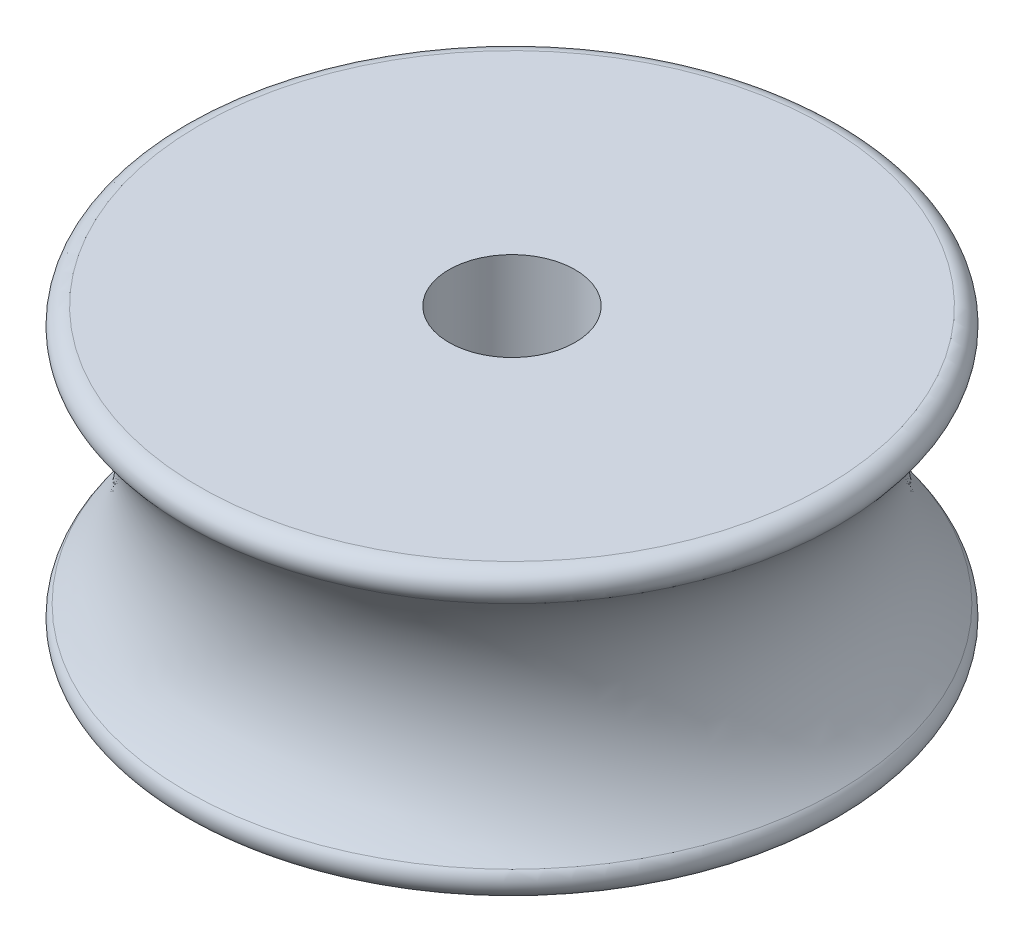
ISO-10303-21;
HEADER;
FILE_DESCRIPTION(('STEP AP214'),'2;1');
FILE_NAME('part.step','',(''),(''),'','','');
FILE_SCHEMA(('AUTOMOTIVE_DESIGN { 1 0 10303 214 1 1 1 1 }'));
ENDSEC;
DATA;
#1=APPLICATION_CONTEXT('core data for automotive mechanical design processes');
#2=APPLICATION_PROTOCOL_DEFINITION('international standard','automotive_design',2000,#1);
#3=PRODUCT_CONTEXT('',#1,'mechanical');
#4=PRODUCT('Part','Part','',(#3));
#5=PRODUCT_RELATED_PRODUCT_CATEGORY('part','',(#4));
#6=PRODUCT_DEFINITION_FORMATION('','',#4);
#7=PRODUCT_DEFINITION_CONTEXT('part definition',#1,'design');
#8=PRODUCT_DEFINITION('design','',#6,#7);
#9=PRODUCT_DEFINITION_SHAPE('','',#8);
#10=(LENGTH_UNIT() NAMED_UNIT(*) SI_UNIT(.MILLI.,.METRE.));
#11=(NAMED_UNIT(*) PLANE_ANGLE_UNIT() SI_UNIT($,.RADIAN.));
#12=(NAMED_UNIT(*) SI_UNIT($,.STERADIAN.) SOLID_ANGLE_UNIT());
#13=UNCERTAINTY_MEASURE_WITH_UNIT(LENGTH_MEASURE(1.E-05),#10,'distance_accuracy_value','');
#14=(GEOMETRIC_REPRESENTATION_CONTEXT(3) GLOBAL_UNCERTAINTY_ASSIGNED_CONTEXT((#13)) GLOBAL_UNIT_ASSIGNED_CONTEXT((#10,
#11,#12)) REPRESENTATION_CONTEXT('',''));
#15=CARTESIAN_POINT('',(0.,0.,0.));
#16=DIRECTION('',(0.,0.,1.));
#17=DIRECTION('',(1.,0.,0.));
#18=AXIS2_PLACEMENT_3D('',#15,#16,#17);
#19=CARTESIAN_POINT('',(18.,0.,0.));
#20=DIRECTION('',(0.,-1.,0.));
#21=DIRECTION('',(1.,0.,0.));
#22=AXIS2_PLACEMENT_3D('',#19,#20,#21);
#23=TOROIDAL_SURFACE('',#22,19.,7.2);
#24=CARTESIAN_POINT('',(18.,-4.83037974683544,0.));
#25=DIRECTION('',(0.,1.,0.));
#26=DIRECTION('',(-1.,0.,0.));
#27=AXIS2_PLACEMENT_3D('',#24,#25,#26);
#28=CIRCLE('',#27,13.6607648954778);
#29=CARTESIAN_POINT('',(4.33923510452217,-4.83037974683544,0.));
#30=VERTEX_POINT('',#29);
#31=EDGE_CURVE('E46',#30,#30,#28,.T.);
#32=ORIENTED_EDGE('',*,*,#31,.T.);
#33=EDGE_LOOP('',(#32));
#34=FACE_BOUND('',#33,.T.);
#35=CARTESIAN_POINT('',(18.,4.83037974683545,0.));
#36=DIRECTION('',(0.,-1.,0.));
#37=DIRECTION('',(1.,0.,0.));
#38=AXIS2_PLACEMENT_3D('',#35,#36,#37);
#39=CIRCLE('',#38,13.6607648954778);
#40=CARTESIAN_POINT('',(31.6607648954778,4.83037974683545,0.));
#41=VERTEX_POINT('',#40);
#42=EDGE_CURVE('E49',#41,#41,#39,.T.);
#43=ORIENTED_EDGE('',*,*,#42,.T.);
#44=EDGE_LOOP('',(#43));
#45=FACE_BOUND('',#44,.T.);
#46=ADVANCED_FACE('F39',(#34,#45),#23,.F.);
#47=CARTESIAN_POINT('',(0.,-6.,0.));
#48=DIRECTION('',(0.,-1.,0.));
#49=DIRECTION('',(1.,0.,0.));
#50=AXIS2_PLACEMENT_3D('',#47,#48,#49);
#51=PLANE('',#50);
#52=CARTESIAN_POINT('',(18.,-6.,0.));
#53=DIRECTION('',(0.,-1.,0.));
#54=DIRECTION('',(1.,0.,0.));
#55=AXIS2_PLACEMENT_3D('',#52,#53,#54);
#56=CIRCLE('',#55,13.1416725936493);
#57=CARTESIAN_POINT('',(31.1416725936493,-5.99999999999999,0.));
#58=VERTEX_POINT('',#57);
#59=EDGE_CURVE('E53',#58,#58,#56,.T.);
#60=ORIENTED_EDGE('',*,*,#59,.T.);
#61=EDGE_LOOP('',(#60));
#62=FACE_BOUND('',#61,.T.);
#63=CARTESIAN_POINT('',(18.,-6.,0.));
#64=DIRECTION('',(0.,-1.,0.));
#65=DIRECTION('',(1.,0.,0.));
#66=AXIS2_PLACEMENT_3D('',#63,#64,#65);
#67=CIRCLE('',#66,2.65);
#68=CARTESIAN_POINT('',(20.65,-6.,0.));
#69=VERTEX_POINT('',#68);
#70=EDGE_CURVE('E56',#69,#69,#67,.T.);
#71=ORIENTED_EDGE('',*,*,#70,.F.);
#72=EDGE_LOOP('',(#71));
#73=FACE_BOUND('',#72,.T.);
#74=ADVANCED_FACE('F71',(#62,#73),#51,.T.);
#75=CARTESIAN_POINT('',(18.,-6.,0.));
#76=DIRECTION('',(0.,-1.,0.));
#77=DIRECTION('',(1.,0.,0.));
#78=AXIS2_PLACEMENT_3D('',#75,#76,#77);
#79=CYLINDRICAL_SURFACE('',#78,2.65);
#80=CARTESIAN_POINT('',(18.,6.,0.));
#81=DIRECTION('',(0.,-1.,0.));
#82=DIRECTION('',(1.,0.,0.));
#83=AXIS2_PLACEMENT_3D('',#80,#81,#82);
#84=CIRCLE('',#83,2.65);
#85=CARTESIAN_POINT('',(20.65,6.,0.));
#86=VERTEX_POINT('',#85);
#87=EDGE_CURVE('E65',#86,#86,#84,.T.);
#88=ORIENTED_EDGE('',*,*,#87,.F.);
#89=EDGE_LOOP('',(#88));
#90=FACE_BOUND('',#89,.T.);
#91=ORIENTED_EDGE('',*,*,#70,.T.);
#92=EDGE_LOOP('',(#91));
#93=FACE_BOUND('',#92,.T.);
#94=ADVANCED_FACE('F69',(#90,#93),#79,.F.);
#95=CARTESIAN_POINT('',(0.,6.,0.));
#96=DIRECTION('',(0.,-1.,0.));
#97=DIRECTION('',(1.,0.,0.));
#98=AXIS2_PLACEMENT_3D('',#95,#96,#97);
#99=PLANE('',#98);
#100=CARTESIAN_POINT('',(18.,6.,0.));
#101=DIRECTION('',(0.,-1.,0.));
#102=DIRECTION('',(1.,0.,0.));
#103=AXIS2_PLACEMENT_3D('',#100,#101,#102);
#104=CIRCLE('',#103,13.1416725936493);
#105=CARTESIAN_POINT('',(31.1416725936493,6.00000000000001,0.));
#106=VERTEX_POINT('',#105);
#107=EDGE_CURVE('E10',#106,#106,#104,.F.);
#108=ORIENTED_EDGE('',*,*,#107,.T.);
#109=EDGE_LOOP('',(#108));
#110=FACE_BOUND('',#109,.T.);
#111=ORIENTED_EDGE('',*,*,#87,.T.);
#112=EDGE_LOOP('',(#111));
#113=FACE_BOUND('',#112,.T.);
#114=ADVANCED_FACE('F67',(#110,#113),#99,.F.);
#115=CARTESIAN_POINT('',(18.,-5.3,0.));
#116=DIRECTION('',(0.,1.,0.));
#117=DIRECTION('',(-1.,0.,0.));
#118=AXIS2_PLACEMENT_3D('',#115,#116,#117);
#119=TOROIDAL_SURFACE('',#118,13.1416725936493,0.7);
#120=ORIENTED_EDGE('',*,*,#31,.F.);
#121=EDGE_LOOP('',(#120));
#122=FACE_BOUND('',#121,.T.);
#123=ORIENTED_EDGE('',*,*,#59,.F.);
#124=EDGE_LOOP('',(#123));
#125=FACE_BOUND('',#124,.T.);
#126=ADVANCED_FACE('F81',(#122,#125),#119,.T.);
#127=CARTESIAN_POINT('',(18.,5.3,0.));
#128=DIRECTION('',(0.,1.,0.));
#129=DIRECTION('',(-1.,0.,0.));
#130=AXIS2_PLACEMENT_3D('',#127,#128,#129);
#131=TOROIDAL_SURFACE('',#130,13.1416725936493,0.7);
#132=ORIENTED_EDGE('',*,*,#107,.F.);
#133=EDGE_LOOP('',(#132));
#134=FACE_BOUND('',#133,.T.);
#135=ORIENTED_EDGE('',*,*,#42,.F.);
#136=EDGE_LOOP('',(#135));
#137=FACE_BOUND('',#136,.T.);
#138=ADVANCED_FACE('F41',(#134,#137),#131,.T.);
#139=CLOSED_SHELL('',(#46,#74,#94,#114,#126,#138));
#140=MANIFOLD_SOLID_BREP('B2',#139);
#141=ADVANCED_BREP_SHAPE_REPRESENTATION('',(#18,#140),#14);
#142=SHAPE_DEFINITION_REPRESENTATION(#9,#141);
ENDSEC;
END-ISO-10303-21;
